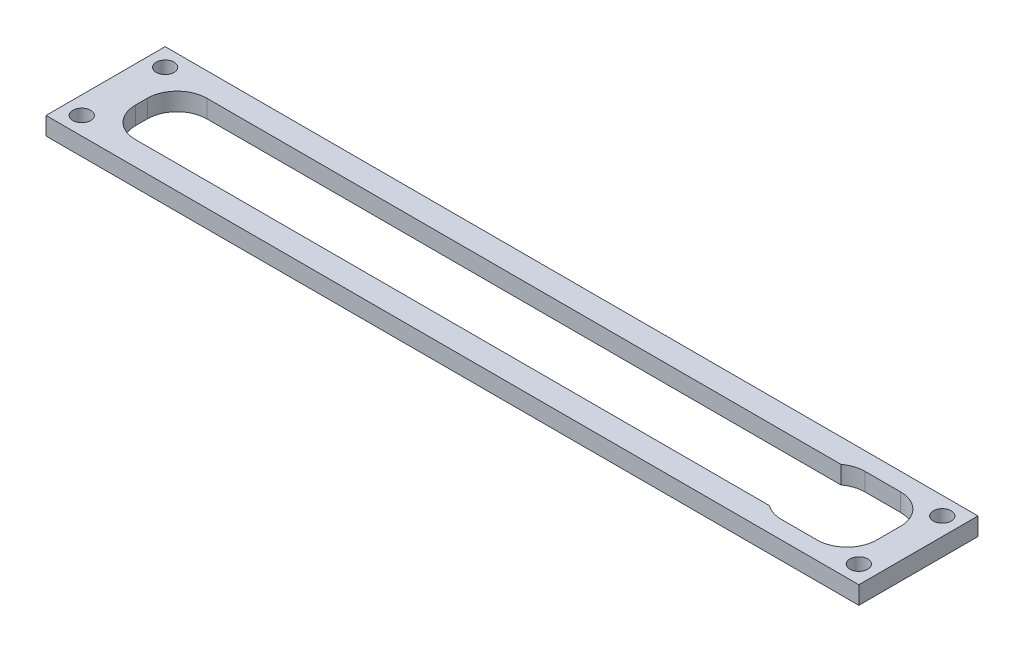
ISO-10303-21;
HEADER;
FILE_DESCRIPTION(('STEP AP214'),'2;1');
FILE_NAME('part.step','',(''),(''),'','','');
FILE_SCHEMA(('AUTOMOTIVE_DESIGN { 1 0 10303 214 1 1 1 1 }'));
ENDSEC;
DATA;
#1=APPLICATION_CONTEXT('core data for automotive mechanical design processes');
#2=APPLICATION_PROTOCOL_DEFINITION('international standard','automotive_design',2000,#1);
#3=PRODUCT_CONTEXT('',#1,'mechanical');
#4=PRODUCT('Part','Part','',(#3));
#5=PRODUCT_RELATED_PRODUCT_CATEGORY('part','',(#4));
#6=PRODUCT_DEFINITION_FORMATION('','',#4);
#7=PRODUCT_DEFINITION_CONTEXT('part definition',#1,'design');
#8=PRODUCT_DEFINITION('design','',#6,#7);
#9=PRODUCT_DEFINITION_SHAPE('','',#8);
#10=(LENGTH_UNIT() NAMED_UNIT(*) SI_UNIT(.MILLI.,.METRE.));
#11=(NAMED_UNIT(*) PLANE_ANGLE_UNIT() SI_UNIT($,.RADIAN.));
#12=(NAMED_UNIT(*) SI_UNIT($,.STERADIAN.) SOLID_ANGLE_UNIT());
#13=UNCERTAINTY_MEASURE_WITH_UNIT(LENGTH_MEASURE(1.E-05),#10,'distance_accuracy_value','');
#14=(GEOMETRIC_REPRESENTATION_CONTEXT(3) GLOBAL_UNCERTAINTY_ASSIGNED_CONTEXT((#13)) GLOBAL_UNIT_ASSIGNED_CONTEXT((#10,
#11,#12)) REPRESENTATION_CONTEXT('',''));
#15=CARTESIAN_POINT('',(0.,0.,0.));
#16=DIRECTION('',(0.,0.,1.));
#17=DIRECTION('',(1.,0.,0.));
#18=AXIS2_PLACEMENT_3D('',#15,#16,#17);
#19=CARTESIAN_POINT('',(0.,3.,0.));
#20=DIRECTION('',(0.,-1.,0.));
#21=DIRECTION('',(0.,0.,-1.));
#22=AXIS2_PLACEMENT_3D('',#19,#20,#21);
#23=PLANE('',#22);
#24=DIRECTION('',(0.,0.,1.));
#25=VECTOR('',#24,1.);
#26=CARTESIAN_POINT('',(0.,3.,0.));
#27=LINE('',#26,#25);
#28=CARTESIAN_POINT('',(0.,3.,-20.));
#29=VERTEX_POINT('',#28);
#30=CARTESIAN_POINT('',(0.,3.,0.));
#31=VERTEX_POINT('',#30);
#32=EDGE_CURVE('E250',#29,#31,#27,.T.);
#33=ORIENTED_EDGE('',*,*,#32,.T.);
#34=DIRECTION('',(1.,0.,0.));
#35=VECTOR('',#34,1.);
#36=CARTESIAN_POINT('',(0.,3.,0.));
#37=LINE('',#36,#35);
#38=CARTESIAN_POINT('',(136.427821804855,3.,0.));
#39=VERTEX_POINT('',#38);
#40=EDGE_CURVE('E253',#31,#39,#37,.T.);
#41=ORIENTED_EDGE('',*,*,#40,.T.);
#42=DIRECTION('',(0.,0.,-1.));
#43=VECTOR('',#42,1.);
#44=CARTESIAN_POINT('',(136.427821804855,3.,0.));
#45=LINE('',#44,#43);
#46=CARTESIAN_POINT('',(136.427821804855,3.,-20.));
#47=VERTEX_POINT('',#46);
#48=EDGE_CURVE('E256',#39,#47,#45,.T.);
#49=ORIENTED_EDGE('',*,*,#48,.T.);
#50=DIRECTION('',(-1.,0.,0.));
#51=VECTOR('',#50,1.);
#52=CARTESIAN_POINT('',(0.,3.,-20.));
#53=LINE('',#52,#51);
#54=EDGE_CURVE('E258',#47,#29,#53,.T.);
#55=ORIENTED_EDGE('',*,*,#54,.T.);
#56=EDGE_LOOP('',(#33,#41,#49,#55));
#57=FACE_BOUND('',#56,.T.);
#58=DIRECTION('',(-1.,0.,0.));
#59=VECTOR('',#58,1.);
#60=CARTESIAN_POINT('',(5.99999999999999,3.,-16.));
#61=LINE('',#60,#59);
#62=CARTESIAN_POINT('',(117.427821804855,3.,-16.));
#63=VERTEX_POINT('',#62);
#64=CARTESIAN_POINT('',(11.,3.,-16.));
#65=VERTEX_POINT('',#64);
#66=EDGE_CURVE('E243',#63,#65,#61,.T.);
#67=ORIENTED_EDGE('',*,*,#66,.F.);
#68=CARTESIAN_POINT('',(120.427821804855,3.,-12.));
#69=DIRECTION('',(0.,-1.,0.));
#70=DIRECTION('',(0.,0.,-1.));
#71=AXIS2_PLACEMENT_3D('',#68,#69,#70);
#72=CIRCLE('',#71,5.);
#73=CARTESIAN_POINT('',(120.427821804855,3.,-17.));
#74=VERTEX_POINT('',#73);
#75=EDGE_CURVE('E193',#63,#74,#72,.T.);
#76=ORIENTED_EDGE('',*,*,#75,.T.);
#77=DIRECTION('',(-1.,0.,0.));
#78=VECTOR('',#77,1.);
#79=CARTESIAN_POINT('',(117.427821804855,3.,-17.));
#80=LINE('',#79,#78);
#81=CARTESIAN_POINT('',(126.427821804855,3.,-17.));
#82=VERTEX_POINT('',#81);
#83=EDGE_CURVE('E205',#82,#74,#80,.T.);
#84=ORIENTED_EDGE('',*,*,#83,.F.);
#85=CARTESIAN_POINT('',(126.427821804855,3.,-12.));
#86=DIRECTION('',(0.,-1.,0.));
#87=DIRECTION('',(0.,0.,-1.));
#88=AXIS2_PLACEMENT_3D('',#85,#86,#87);
#89=CIRCLE('',#88,5.);
#90=CARTESIAN_POINT('',(131.427821804855,3.,-12.));
#91=VERTEX_POINT('',#90);
#92=EDGE_CURVE('E185',#82,#91,#89,.T.);
#93=ORIENTED_EDGE('',*,*,#92,.T.);
#94=DIRECTION('',(0.,0.,-1.));
#95=VECTOR('',#94,1.);
#96=CARTESIAN_POINT('',(131.427821804855,3.,-17.));
#97=LINE('',#96,#95);
#98=CARTESIAN_POINT('',(131.427821804855,3.,-8.00000000000001));
#99=VERTEX_POINT('',#98);
#100=EDGE_CURVE('E202',#99,#91,#97,.T.);
#101=ORIENTED_EDGE('',*,*,#100,.F.);
#102=CARTESIAN_POINT('',(126.427821804855,3.,-8.00000000000001));
#103=DIRECTION('',(0.,-1.,0.));
#104=DIRECTION('',(0.,0.,-1.));
#105=AXIS2_PLACEMENT_3D('',#102,#103,#104);
#106=CIRCLE('',#105,5.);
#107=CARTESIAN_POINT('',(126.427821804855,3.,-3.00000000000001));
#108=VERTEX_POINT('',#107);
#109=EDGE_CURVE('E189',#99,#108,#106,.T.);
#110=ORIENTED_EDGE('',*,*,#109,.T.);
#111=DIRECTION('',(1.,0.,0.));
#112=VECTOR('',#111,1.);
#113=CARTESIAN_POINT('',(117.427821804855,3.,-3.00000000000001));
#114=LINE('',#113,#112);
#115=CARTESIAN_POINT('',(120.427821804855,3.,-3.00000000000001));
#116=VERTEX_POINT('',#115);
#117=EDGE_CURVE('E200',#116,#108,#114,.T.);
#118=ORIENTED_EDGE('',*,*,#117,.F.);
#119=CARTESIAN_POINT('',(120.427821804855,3.,-8.00000000000001));
#120=DIRECTION('',(0.,-1.,0.));
#121=DIRECTION('',(0.,0.,-1.));
#122=AXIS2_PLACEMENT_3D('',#119,#120,#121);
#123=CIRCLE('',#122,5.);
#124=CARTESIAN_POINT('',(117.427821804855,3.,-4.00000000000002));
#125=VERTEX_POINT('',#124);
#126=EDGE_CURVE('E43',#116,#125,#123,.T.);
#127=ORIENTED_EDGE('',*,*,#126,.T.);
#128=DIRECTION('',(1.,0.,0.));
#129=VECTOR('',#128,1.);
#130=CARTESIAN_POINT('',(5.99999999999999,3.,-4.00000000000002));
#131=LINE('',#130,#129);
#132=CARTESIAN_POINT('',(11.,3.,-4.00000000000002));
#133=VERTEX_POINT('',#132);
#134=EDGE_CURVE('E162',#133,#125,#131,.T.);
#135=ORIENTED_EDGE('',*,*,#134,.F.);
#136=CARTESIAN_POINT('',(11.,3.,-9.00000000000001));
#137=DIRECTION('',(0.,-1.,0.));
#138=DIRECTION('',(0.,0.,-1.));
#139=AXIS2_PLACEMENT_3D('',#136,#137,#138);
#140=CIRCLE('',#139,5.);
#141=CARTESIAN_POINT('',(5.99999999999999,3.,-9.00000000000001));
#142=VERTEX_POINT('',#141);
#143=EDGE_CURVE('E179',#133,#142,#140,.T.);
#144=ORIENTED_EDGE('',*,*,#143,.T.);
#145=DIRECTION('',(0.,0.,1.));
#146=VECTOR('',#145,1.);
#147=CARTESIAN_POINT('',(5.99999999999999,3.,-16.));
#148=LINE('',#147,#146);
#149=CARTESIAN_POINT('',(5.99999999999999,3.,-11.));
#150=VERTEX_POINT('',#149);
#151=EDGE_CURVE('E239',#150,#142,#148,.T.);
#152=ORIENTED_EDGE('',*,*,#151,.F.);
#153=CARTESIAN_POINT('',(11.,3.,-11.));
#154=DIRECTION('',(0.,-1.,0.));
#155=DIRECTION('',(0.,0.,-1.));
#156=AXIS2_PLACEMENT_3D('',#153,#154,#155);
#157=CIRCLE('',#156,5.);
#158=EDGE_CURVE('E183',#150,#65,#157,.T.);
#159=ORIENTED_EDGE('',*,*,#158,.T.);
#160=EDGE_LOOP('',(#67,#76,#84,#93,#101,#110,#118,#127,#135,#144,#152,#159));
#161=FACE_BOUND('',#160,.T.);
#162=CARTESIAN_POINT('',(3.,3.,-17.));
#163=DIRECTION('',(0.,1.,0.));
#164=DIRECTION('',(0.,0.,1.));
#165=AXIS2_PLACEMENT_3D('',#162,#163,#164);
#166=CIRCLE('',#165,1.5);
#167=CARTESIAN_POINT('',(3.,3.,-15.5));
#168=VERTEX_POINT('',#167);
#169=EDGE_CURVE('E234',#168,#168,#166,.T.);
#170=ORIENTED_EDGE('',*,*,#169,.F.);
#171=EDGE_LOOP('',(#170));
#172=FACE_BOUND('',#171,.T.);
#173=CARTESIAN_POINT('',(3.,3.,-3.));
#174=DIRECTION('',(0.,1.,0.));
#175=DIRECTION('',(0.,0.,-1.));
#176=AXIS2_PLACEMENT_3D('',#173,#174,#175);
#177=CIRCLE('',#176,1.5);
#178=CARTESIAN_POINT('',(3.,3.,-4.5));
#179=VERTEX_POINT('',#178);
#180=EDGE_CURVE('E228',#179,#179,#177,.T.);
#181=ORIENTED_EDGE('',*,*,#180,.F.);
#182=EDGE_LOOP('',(#181));
#183=FACE_BOUND('',#182,.T.);
#184=CARTESIAN_POINT('',(133.427821804855,3.,-3.00000000000002));
#185=DIRECTION('',(0.,1.,0.));
#186=DIRECTION('',(0.,0.,1.));
#187=AXIS2_PLACEMENT_3D('',#184,#185,#186);
#188=CIRCLE('',#187,1.5);
#189=CARTESIAN_POINT('',(133.427821804855,3.,-1.50000000000002));
#190=VERTEX_POINT('',#189);
#191=EDGE_CURVE('E222',#190,#190,#188,.T.);
#192=ORIENTED_EDGE('',*,*,#191,.F.);
#193=EDGE_LOOP('',(#192));
#194=FACE_BOUND('',#193,.T.);
#195=CARTESIAN_POINT('',(133.427821804855,3.,-17.0000000000001));
#196=DIRECTION('',(0.,1.,0.));
#197=DIRECTION('',(0.,0.,-1.));
#198=AXIS2_PLACEMENT_3D('',#195,#196,#197);
#199=CIRCLE('',#198,1.5);
#200=CARTESIAN_POINT('',(133.427821804855,3.,-18.5));
#201=VERTEX_POINT('',#200);
#202=EDGE_CURVE('E216',#201,#201,#199,.T.);
#203=ORIENTED_EDGE('',*,*,#202,.F.);
#204=EDGE_LOOP('',(#203));
#205=FACE_BOUND('',#204,.T.);
#206=ADVANCED_FACE('F35',(#57,#161,#172,#183,#194,#205),#23,.F.);
#207=CARTESIAN_POINT('',(0.,0.,0.));
#208=DIRECTION('',(0.,-1.,0.));
#209=DIRECTION('',(0.,0.,-1.));
#210=AXIS2_PLACEMENT_3D('',#207,#208,#209);
#211=PLANE('',#210);
#212=DIRECTION('',(-1.,0.,0.));
#213=VECTOR('',#212,1.);
#214=CARTESIAN_POINT('',(117.427821804855,0.,-17.));
#215=LINE('',#214,#213);
#216=CARTESIAN_POINT('',(126.427821804855,0.,-17.));
#217=VERTEX_POINT('',#216);
#218=CARTESIAN_POINT('',(120.427821804855,0.,-17.));
#219=VERTEX_POINT('',#218);
#220=EDGE_CURVE('E165',#217,#219,#215,.T.);
#221=ORIENTED_EDGE('',*,*,#220,.T.);
#222=CARTESIAN_POINT('',(120.427821804855,0.,-12.));
#223=DIRECTION('',(0.,-1.,0.));
#224=DIRECTION('',(0.,0.,-1.));
#225=AXIS2_PLACEMENT_3D('',#222,#223,#224);
#226=CIRCLE('',#225,5.);
#227=CARTESIAN_POINT('',(117.427821804855,0.,-16.));
#228=VERTEX_POINT('',#227);
#229=EDGE_CURVE('E195',#219,#228,#226,.F.);
#230=ORIENTED_EDGE('',*,*,#229,.T.);
#231=DIRECTION('',(-1.,0.,0.));
#232=VECTOR('',#231,1.);
#233=CARTESIAN_POINT('',(5.99999999999999,0.,-16.));
#234=LINE('',#233,#232);
#235=CARTESIAN_POINT('',(11.,0.,-16.));
#236=VERTEX_POINT('',#235);
#237=EDGE_CURVE('E154',#228,#236,#234,.T.);
#238=ORIENTED_EDGE('',*,*,#237,.T.);
#239=CARTESIAN_POINT('',(11.,0.,-11.));
#240=DIRECTION('',(0.,-1.,0.));
#241=DIRECTION('',(0.,0.,-1.));
#242=AXIS2_PLACEMENT_3D('',#239,#240,#241);
#243=CIRCLE('',#242,5.);
#244=CARTESIAN_POINT('',(5.99999999999999,0.,-11.));
#245=VERTEX_POINT('',#244);
#246=EDGE_CURVE('E181',#236,#245,#243,.F.);
#247=ORIENTED_EDGE('',*,*,#246,.T.);
#248=DIRECTION('',(0.,0.,1.));
#249=VECTOR('',#248,1.);
#250=CARTESIAN_POINT('',(5.99999999999999,0.,-16.));
#251=LINE('',#250,#249);
#252=CARTESIAN_POINT('',(5.99999999999999,0.,-9.00000000000001));
#253=VERTEX_POINT('',#252);
#254=EDGE_CURVE('E155',#245,#253,#251,.T.);
#255=ORIENTED_EDGE('',*,*,#254,.T.);
#256=CARTESIAN_POINT('',(11.,0.,-9.00000000000001));
#257=DIRECTION('',(0.,-1.,0.));
#258=DIRECTION('',(0.,0.,-1.));
#259=AXIS2_PLACEMENT_3D('',#256,#257,#258);
#260=CIRCLE('',#259,5.);
#261=CARTESIAN_POINT('',(11.,0.,-4.00000000000002));
#262=VERTEX_POINT('',#261);
#263=EDGE_CURVE('E151',#253,#262,#260,.F.);
#264=ORIENTED_EDGE('',*,*,#263,.T.);
#265=DIRECTION('',(1.,0.,0.));
#266=VECTOR('',#265,1.);
#267=CARTESIAN_POINT('',(5.99999999999999,0.,-4.00000000000002));
#268=LINE('',#267,#266);
#269=CARTESIAN_POINT('',(117.427821804855,0.,-4.00000000000002));
#270=VERTEX_POINT('',#269);
#271=EDGE_CURVE('E145',#262,#270,#268,.T.);
#272=ORIENTED_EDGE('',*,*,#271,.T.);
#273=CARTESIAN_POINT('',(120.427821804855,0.,-8.00000000000001));
#274=DIRECTION('',(0.,-1.,0.));
#275=DIRECTION('',(0.,0.,-1.));
#276=AXIS2_PLACEMENT_3D('',#273,#274,#275);
#277=CIRCLE('',#276,5.);
#278=CARTESIAN_POINT('',(120.427821804855,0.,-3.00000000000001));
#279=VERTEX_POINT('',#278);
#280=EDGE_CURVE('E11',#270,#279,#277,.F.);
#281=ORIENTED_EDGE('',*,*,#280,.T.);
#282=DIRECTION('',(1.,0.,0.));
#283=VECTOR('',#282,1.);
#284=CARTESIAN_POINT('',(117.427821804855,0.,-3.00000000000001));
#285=LINE('',#284,#283);
#286=CARTESIAN_POINT('',(126.427821804855,0.,-3.00000000000001));
#287=VERTEX_POINT('',#286);
#288=EDGE_CURVE('E212',#279,#287,#285,.T.);
#289=ORIENTED_EDGE('',*,*,#288,.T.);
#290=CARTESIAN_POINT('',(126.427821804855,0.,-8.00000000000001));
#291=DIRECTION('',(0.,-1.,0.));
#292=DIRECTION('',(0.,0.,-1.));
#293=AXIS2_PLACEMENT_3D('',#290,#291,#292);
#294=CIRCLE('',#293,5.);
#295=CARTESIAN_POINT('',(131.427821804855,0.,-8.00000000000001));
#296=VERTEX_POINT('',#295);
#297=EDGE_CURVE('E191',#287,#296,#294,.F.);
#298=ORIENTED_EDGE('',*,*,#297,.T.);
#299=DIRECTION('',(0.,0.,-1.));
#300=VECTOR('',#299,1.);
#301=CARTESIAN_POINT('',(131.427821804855,0.,-17.));
#302=LINE('',#301,#300);
#303=CARTESIAN_POINT('',(131.427821804855,0.,-12.));
#304=VERTEX_POINT('',#303);
#305=EDGE_CURVE('E300',#296,#304,#302,.T.);
#306=ORIENTED_EDGE('',*,*,#305,.T.);
#307=CARTESIAN_POINT('',(126.427821804855,0.,-12.));
#308=DIRECTION('',(0.,-1.,0.));
#309=DIRECTION('',(0.,0.,-1.));
#310=AXIS2_PLACEMENT_3D('',#307,#308,#309);
#311=CIRCLE('',#310,5.);
#312=EDGE_CURVE('E187',#304,#217,#311,.F.);
#313=ORIENTED_EDGE('',*,*,#312,.T.);
#314=EDGE_LOOP('',(#221,#230,#238,#247,#255,#264,#272,#281,#289,#298,#306,#313));
#315=FACE_BOUND('',#314,.T.);
#316=CARTESIAN_POINT('',(133.427821804855,0.,-3.00000000000002));
#317=DIRECTION('',(0.,1.,0.));
#318=DIRECTION('',(0.,0.,1.));
#319=AXIS2_PLACEMENT_3D('',#316,#317,#318);
#320=CIRCLE('',#319,1.5);
#321=CARTESIAN_POINT('',(133.427821804855,0.,-1.50000000000002));
#322=VERTEX_POINT('',#321);
#323=EDGE_CURVE('E219',#322,#322,#320,.T.);
#324=ORIENTED_EDGE('',*,*,#323,.T.);
#325=EDGE_LOOP('',(#324));
#326=FACE_BOUND('',#325,.T.);
#327=CARTESIAN_POINT('',(3.,0.,-17.));
#328=DIRECTION('',(0.,1.,0.));
#329=DIRECTION('',(0.,0.,1.));
#330=AXIS2_PLACEMENT_3D('',#327,#328,#329);
#331=CIRCLE('',#330,1.5);
#332=CARTESIAN_POINT('',(3.,0.,-15.5));
#333=VERTEX_POINT('',#332);
#334=EDGE_CURVE('E231',#333,#333,#331,.T.);
#335=ORIENTED_EDGE('',*,*,#334,.T.);
#336=EDGE_LOOP('',(#335));
#337=FACE_BOUND('',#336,.T.);
#338=DIRECTION('',(0.,0.,1.));
#339=VECTOR('',#338,1.);
#340=CARTESIAN_POINT('',(0.,0.,0.));
#341=LINE('',#340,#339);
#342=CARTESIAN_POINT('',(0.,0.,-20.));
#343=VERTEX_POINT('',#342);
#344=CARTESIAN_POINT('',(0.,0.,0.));
#345=VERTEX_POINT('',#344);
#346=EDGE_CURVE('E246',#343,#345,#341,.T.);
#347=ORIENTED_EDGE('',*,*,#346,.F.);
#348=DIRECTION('',(-1.,0.,0.));
#349=VECTOR('',#348,1.);
#350=CARTESIAN_POINT('',(0.,0.,-20.));
#351=LINE('',#350,#349);
#352=CARTESIAN_POINT('',(136.427821804855,0.,-20.));
#353=VERTEX_POINT('',#352);
#354=EDGE_CURVE('E254',#353,#343,#351,.T.);
#355=ORIENTED_EDGE('',*,*,#354,.F.);
#356=DIRECTION('',(0.,0.,-1.));
#357=VECTOR('',#356,1.);
#358=CARTESIAN_POINT('',(136.427821804855,0.,0.));
#359=LINE('',#358,#357);
#360=CARTESIAN_POINT('',(136.427821804855,0.,0.));
#361=VERTEX_POINT('',#360);
#362=EDGE_CURVE('E265',#361,#353,#359,.T.);
#363=ORIENTED_EDGE('',*,*,#362,.F.);
#364=DIRECTION('',(1.,0.,0.));
#365=VECTOR('',#364,1.);
#366=CARTESIAN_POINT('',(0.,0.,0.));
#367=LINE('',#366,#365);
#368=EDGE_CURVE('E263',#345,#361,#367,.T.);
#369=ORIENTED_EDGE('',*,*,#368,.F.);
#370=EDGE_LOOP('',(#347,#355,#363,#369));
#371=FACE_BOUND('',#370,.T.);
#372=CARTESIAN_POINT('',(3.,0.,-3.));
#373=DIRECTION('',(0.,1.,0.));
#374=DIRECTION('',(0.,0.,-1.));
#375=AXIS2_PLACEMENT_3D('',#372,#373,#374);
#376=CIRCLE('',#375,1.5);
#377=CARTESIAN_POINT('',(3.,0.,-4.5));
#378=VERTEX_POINT('',#377);
#379=EDGE_CURVE('E225',#378,#378,#376,.T.);
#380=ORIENTED_EDGE('',*,*,#379,.T.);
#381=EDGE_LOOP('',(#380));
#382=FACE_BOUND('',#381,.T.);
#383=CARTESIAN_POINT('',(133.427821804855,0.,-17.0000000000001));
#384=DIRECTION('',(0.,1.,0.));
#385=DIRECTION('',(0.,0.,-1.));
#386=AXIS2_PLACEMENT_3D('',#383,#384,#385);
#387=CIRCLE('',#386,1.5);
#388=CARTESIAN_POINT('',(133.427821804855,0.,-18.5));
#389=VERTEX_POINT('',#388);
#390=EDGE_CURVE('E214',#389,#389,#387,.T.);
#391=ORIENTED_EDGE('',*,*,#390,.T.);
#392=EDGE_LOOP('',(#391));
#393=FACE_BOUND('',#392,.T.);
#394=ADVANCED_FACE('F148',(#315,#326,#337,#371,#382,#393),#211,.T.);
#395=CARTESIAN_POINT('',(0.,3.,0.));
#396=DIRECTION('',(1.,0.,0.));
#397=DIRECTION('',(0.,0.,-1.));
#398=AXIS2_PLACEMENT_3D('',#395,#396,#397);
#399=PLANE('',#398);
#400=ORIENTED_EDGE('',*,*,#346,.T.);
#401=DIRECTION('',(0.,-1.,0.));
#402=VECTOR('',#401,1.);
#403=CARTESIAN_POINT('',(0.,3.,0.));
#404=LINE('',#403,#402);
#405=EDGE_CURVE('E276',#31,#345,#404,.T.);
#406=ORIENTED_EDGE('',*,*,#405,.F.);
#407=ORIENTED_EDGE('',*,*,#32,.F.);
#408=DIRECTION('',(0.,-1.,0.));
#409=VECTOR('',#408,1.);
#410=CARTESIAN_POINT('',(0.,3.,-20.));
#411=LINE('',#410,#409);
#412=EDGE_CURVE('E260',#29,#343,#411,.T.);
#413=ORIENTED_EDGE('',*,*,#412,.T.);
#414=EDGE_LOOP('',(#400,#406,#407,#413));
#415=FACE_BOUND('',#414,.T.);
#416=ADVANCED_FACE('F331',(#415),#399,.F.);
#417=CARTESIAN_POINT('',(0.,3.,0.));
#418=DIRECTION('',(0.,0.,-1.));
#419=DIRECTION('',(-1.,0.,0.));
#420=AXIS2_PLACEMENT_3D('',#417,#418,#419);
#421=PLANE('',#420);
#422=ORIENTED_EDGE('',*,*,#368,.T.);
#423=DIRECTION('',(0.,-1.,0.));
#424=VECTOR('',#423,1.);
#425=CARTESIAN_POINT('',(136.427821804855,3.,0.));
#426=LINE('',#425,#424);
#427=EDGE_CURVE('E273',#39,#361,#426,.T.);
#428=ORIENTED_EDGE('',*,*,#427,.F.);
#429=ORIENTED_EDGE('',*,*,#40,.F.);
#430=ORIENTED_EDGE('',*,*,#405,.T.);
#431=EDGE_LOOP('',(#422,#428,#429,#430));
#432=FACE_BOUND('',#431,.T.);
#433=ADVANCED_FACE('F344',(#432),#421,.F.);
#434=CARTESIAN_POINT('',(136.427821804855,3.,0.));
#435=DIRECTION('',(-1.,0.,0.));
#436=DIRECTION('',(0.,0.,1.));
#437=AXIS2_PLACEMENT_3D('',#434,#435,#436);
#438=PLANE('',#437);
#439=ORIENTED_EDGE('',*,*,#362,.T.);
#440=DIRECTION('',(0.,-1.,0.));
#441=VECTOR('',#440,1.);
#442=CARTESIAN_POINT('',(136.427821804855,3.,-20.));
#443=LINE('',#442,#441);
#444=EDGE_CURVE('E270',#47,#353,#443,.T.);
#445=ORIENTED_EDGE('',*,*,#444,.F.);
#446=ORIENTED_EDGE('',*,*,#48,.F.);
#447=ORIENTED_EDGE('',*,*,#427,.T.);
#448=EDGE_LOOP('',(#439,#445,#446,#447));
#449=FACE_BOUND('',#448,.T.);
#450=ADVANCED_FACE('F340',(#449),#438,.F.);
#451=CARTESIAN_POINT('',(0.,3.,-20.));
#452=DIRECTION('',(0.,0.,1.));
#453=DIRECTION('',(1.,0.,0.));
#454=AXIS2_PLACEMENT_3D('',#451,#452,#453);
#455=PLANE('',#454);
#456=ORIENTED_EDGE('',*,*,#354,.T.);
#457=ORIENTED_EDGE('',*,*,#412,.F.);
#458=ORIENTED_EDGE('',*,*,#54,.F.);
#459=ORIENTED_EDGE('',*,*,#444,.T.);
#460=EDGE_LOOP('',(#456,#457,#458,#459));
#461=FACE_BOUND('',#460,.T.);
#462=ADVANCED_FACE('F337',(#461),#455,.F.);
#463=CARTESIAN_POINT('',(5.99999999999999,3.,-16.));
#464=DIRECTION('',(1.,0.,0.));
#465=DIRECTION('',(0.,0.,-1.));
#466=AXIS2_PLACEMENT_3D('',#463,#464,#465);
#467=PLANE('',#466);
#468=ORIENTED_EDGE('',*,*,#151,.T.);
#469=DIRECTION('',(0.,-1.,0.));
#470=VECTOR('',#469,1.);
#471=CARTESIAN_POINT('',(5.99999999999999,0.,-9.00000000000001));
#472=LINE('',#471,#470);
#473=EDGE_CURVE('E281',#142,#253,#472,.T.);
#474=ORIENTED_EDGE('',*,*,#473,.T.);
#475=ORIENTED_EDGE('',*,*,#254,.F.);
#476=DIRECTION('',(0.,-1.,0.));
#477=VECTOR('',#476,1.);
#478=CARTESIAN_POINT('',(5.99999999999999,3.,-11.));
#479=LINE('',#478,#477);
#480=EDGE_CURVE('E279',#245,#150,#479,.F.);
#481=ORIENTED_EDGE('',*,*,#480,.T.);
#482=EDGE_LOOP('',(#468,#474,#475,#481));
#483=FACE_BOUND('',#482,.T.);
#484=ADVANCED_FACE('F334',(#483),#467,.T.);
#485=CARTESIAN_POINT('',(5.99999999999999,3.,-4.00000000000002));
#486=DIRECTION('',(0.,0.,-1.));
#487=DIRECTION('',(-1.,0.,0.));
#488=AXIS2_PLACEMENT_3D('',#485,#486,#487);
#489=PLANE('',#488);
#490=ORIENTED_EDGE('',*,*,#271,.F.);
#491=DIRECTION('',(0.,-1.,0.));
#492=VECTOR('',#491,1.);
#493=CARTESIAN_POINT('',(11.,3.,-4.00000000000002));
#494=LINE('',#493,#492);
#495=EDGE_CURVE('E284',#262,#133,#494,.F.);
#496=ORIENTED_EDGE('',*,*,#495,.T.);
#497=ORIENTED_EDGE('',*,*,#134,.T.);
#498=DIRECTION('',(0.,1.,0.));
#499=VECTOR('',#498,1.);
#500=CARTESIAN_POINT('',(117.427821804855,0.,-4.00000000000002));
#501=LINE('',#500,#499);
#502=EDGE_CURVE('E159',#270,#125,#501,.T.);
#503=ORIENTED_EDGE('',*,*,#502,.F.);
#504=EDGE_LOOP('',(#490,#496,#497,#503));
#505=FACE_BOUND('',#504,.T.);
#506=ADVANCED_FACE('F160',(#505),#489,.T.);
#507=CARTESIAN_POINT('',(5.99999999999999,3.,-16.));
#508=DIRECTION('',(0.,0.,1.));
#509=DIRECTION('',(1.,0.,0.));
#510=AXIS2_PLACEMENT_3D('',#507,#508,#509);
#511=PLANE('',#510);
#512=ORIENTED_EDGE('',*,*,#66,.T.);
#513=DIRECTION('',(0.,-1.,0.));
#514=VECTOR('',#513,1.);
#515=CARTESIAN_POINT('',(11.,0.,-16.));
#516=LINE('',#515,#514);
#517=EDGE_CURVE('E286',#65,#236,#516,.T.);
#518=ORIENTED_EDGE('',*,*,#517,.T.);
#519=ORIENTED_EDGE('',*,*,#237,.F.);
#520=DIRECTION('',(0.,1.,0.));
#521=VECTOR('',#520,1.);
#522=CARTESIAN_POINT('',(117.427821804855,0.,-16.));
#523=LINE('',#522,#521);
#524=EDGE_CURVE('E164',#228,#63,#523,.T.);
#525=ORIENTED_EDGE('',*,*,#524,.T.);
#526=EDGE_LOOP('',(#512,#518,#519,#525));
#527=FACE_BOUND('',#526,.T.);
#528=ADVANCED_FACE('F366',(#527),#511,.T.);
#529=CARTESIAN_POINT('',(3.,3.,-17.));
#530=DIRECTION('',(0.,-1.,0.));
#531=DIRECTION('',(0.,0.,-1.));
#532=AXIS2_PLACEMENT_3D('',#529,#530,#531);
#533=CYLINDRICAL_SURFACE('',#532,1.5);
#534=ORIENTED_EDGE('',*,*,#169,.T.);
#535=EDGE_LOOP('',(#534));
#536=FACE_BOUND('',#535,.T.);
#537=ORIENTED_EDGE('',*,*,#334,.F.);
#538=EDGE_LOOP('',(#537));
#539=FACE_BOUND('',#538,.T.);
#540=ADVANCED_FACE('F379',(#536,#539),#533,.F.);
#541=CARTESIAN_POINT('',(3.,3.,-3.));
#542=DIRECTION('',(0.,-1.,0.));
#543=DIRECTION('',(0.,0.,-1.));
#544=AXIS2_PLACEMENT_3D('',#541,#542,#543);
#545=CYLINDRICAL_SURFACE('',#544,1.5);
#546=ORIENTED_EDGE('',*,*,#180,.T.);
#547=EDGE_LOOP('',(#546));
#548=FACE_BOUND('',#547,.T.);
#549=ORIENTED_EDGE('',*,*,#379,.F.);
#550=EDGE_LOOP('',(#549));
#551=FACE_BOUND('',#550,.T.);
#552=ADVANCED_FACE('F384',(#548,#551),#545,.F.);
#553=CARTESIAN_POINT('',(133.427821804855,3.,-3.00000000000002));
#554=DIRECTION('',(0.,-1.,0.));
#555=DIRECTION('',(0.,0.,-1.));
#556=AXIS2_PLACEMENT_3D('',#553,#554,#555);
#557=CYLINDRICAL_SURFACE('',#556,1.5);
#558=ORIENTED_EDGE('',*,*,#191,.T.);
#559=EDGE_LOOP('',(#558));
#560=FACE_BOUND('',#559,.T.);
#561=ORIENTED_EDGE('',*,*,#323,.F.);
#562=EDGE_LOOP('',(#561));
#563=FACE_BOUND('',#562,.T.);
#564=ADVANCED_FACE('F388',(#560,#563),#557,.F.);
#565=CARTESIAN_POINT('',(133.427821804855,3.,-17.0000000000001));
#566=DIRECTION('',(0.,-1.,0.));
#567=DIRECTION('',(0.,0.,-1.));
#568=AXIS2_PLACEMENT_3D('',#565,#566,#567);
#569=CYLINDRICAL_SURFACE('',#568,1.5);
#570=ORIENTED_EDGE('',*,*,#202,.T.);
#571=EDGE_LOOP('',(#570));
#572=FACE_BOUND('',#571,.T.);
#573=ORIENTED_EDGE('',*,*,#390,.F.);
#574=EDGE_LOOP('',(#573));
#575=FACE_BOUND('',#574,.T.);
#576=ADVANCED_FACE('F392',(#572,#575),#569,.F.);
#577=CARTESIAN_POINT('',(117.427821804855,0.,-17.));
#578=DIRECTION('',(0.,0.,-1.));
#579=DIRECTION('',(-1.,0.,0.));
#580=AXIS2_PLACEMENT_3D('',#577,#578,#579);
#581=PLANE('',#580);
#582=ORIENTED_EDGE('',*,*,#220,.F.);
#583=DIRECTION('',(0.,1.,0.));
#584=VECTOR('',#583,1.);
#585=CARTESIAN_POINT('',(126.427821804855,3.,-17.));
#586=LINE('',#585,#584);
#587=EDGE_CURVE('E291',#217,#82,#586,.T.);
#588=ORIENTED_EDGE('',*,*,#587,.T.);
#589=ORIENTED_EDGE('',*,*,#83,.T.);
#590=DIRECTION('',(0.,1.,0.));
#591=VECTOR('',#590,1.);
#592=CARTESIAN_POINT('',(120.427821804855,0.,-17.));
#593=LINE('',#592,#591);
#594=EDGE_CURVE('E289',#74,#219,#593,.F.);
#595=ORIENTED_EDGE('',*,*,#594,.T.);
#596=EDGE_LOOP('',(#582,#588,#589,#595));
#597=FACE_BOUND('',#596,.T.);
#598=ADVANCED_FACE('F310',(#597),#581,.F.);
#599=CARTESIAN_POINT('',(131.427821804855,0.,-17.));
#600=DIRECTION('',(1.,0.,0.));
#601=DIRECTION('',(0.,0.,-1.));
#602=AXIS2_PLACEMENT_3D('',#599,#600,#601);
#603=PLANE('',#602);
#604=ORIENTED_EDGE('',*,*,#100,.T.);
#605=DIRECTION('',(0.,1.,0.));
#606=VECTOR('',#605,1.);
#607=CARTESIAN_POINT('',(131.427821804855,0.,-12.));
#608=LINE('',#607,#606);
#609=EDGE_CURVE('E171',#91,#304,#608,.F.);
#610=ORIENTED_EDGE('',*,*,#609,.T.);
#611=ORIENTED_EDGE('',*,*,#305,.F.);
#612=DIRECTION('',(0.,1.,0.));
#613=VECTOR('',#612,1.);
#614=CARTESIAN_POINT('',(131.427821804855,3.,-8.00000000000001));
#615=LINE('',#614,#613);
#616=EDGE_CURVE('E174',#296,#99,#615,.T.);
#617=ORIENTED_EDGE('',*,*,#616,.T.);
#618=EDGE_LOOP('',(#604,#610,#611,#617));
#619=FACE_BOUND('',#618,.T.);
#620=ADVANCED_FACE('F297',(#619),#603,.F.);
#621=CARTESIAN_POINT('',(117.427821804855,0.,-3.00000000000001));
#622=DIRECTION('',(0.,0.,1.));
#623=DIRECTION('',(1.,0.,0.));
#624=AXIS2_PLACEMENT_3D('',#621,#622,#623);
#625=PLANE('',#624);
#626=ORIENTED_EDGE('',*,*,#117,.T.);
#627=DIRECTION('',(0.,1.,0.));
#628=VECTOR('',#627,1.);
#629=CARTESIAN_POINT('',(126.427821804855,0.,-3.00000000000001));
#630=LINE('',#629,#628);
#631=EDGE_CURVE('E50',#108,#287,#630,.F.);
#632=ORIENTED_EDGE('',*,*,#631,.T.);
#633=ORIENTED_EDGE('',*,*,#288,.F.);
#634=DIRECTION('',(0.,-1.,0.));
#635=VECTOR('',#634,1.);
#636=CARTESIAN_POINT('',(120.427821804855,0.,-3.00000000000001));
#637=LINE('',#636,#635);
#638=EDGE_CURVE('E169',#279,#116,#637,.F.);
#639=ORIENTED_EDGE('',*,*,#638,.T.);
#640=EDGE_LOOP('',(#626,#632,#633,#639));
#641=FACE_BOUND('',#640,.T.);
#642=ADVANCED_FACE('F355',(#641),#625,.F.);
#643=CARTESIAN_POINT('',(11.,3.,-9.00000000000001));
#644=DIRECTION('',(0.,1.,0.));
#645=DIRECTION('',(0.,0.,1.));
#646=AXIS2_PLACEMENT_3D('',#643,#644,#645);
#647=CYLINDRICAL_SURFACE('',#646,5.);
#648=ORIENTED_EDGE('',*,*,#143,.F.);
#649=ORIENTED_EDGE('',*,*,#495,.F.);
#650=ORIENTED_EDGE('',*,*,#263,.F.);
#651=ORIENTED_EDGE('',*,*,#473,.F.);
#652=EDGE_LOOP('',(#648,#649,#650,#651));
#653=FACE_BOUND('',#652,.T.);
#654=ADVANCED_FACE('F352',(#653),#647,.F.);
#655=CARTESIAN_POINT('',(11.,3.,-11.));
#656=DIRECTION('',(0.,1.,0.));
#657=DIRECTION('',(0.,0.,1.));
#658=AXIS2_PLACEMENT_3D('',#655,#656,#657);
#659=CYLINDRICAL_SURFACE('',#658,5.);
#660=ORIENTED_EDGE('',*,*,#158,.F.);
#661=ORIENTED_EDGE('',*,*,#480,.F.);
#662=ORIENTED_EDGE('',*,*,#246,.F.);
#663=ORIENTED_EDGE('',*,*,#517,.F.);
#664=EDGE_LOOP('',(#660,#661,#662,#663));
#665=FACE_BOUND('',#664,.T.);
#666=ADVANCED_FACE('F323',(#665),#659,.F.);
#667=CARTESIAN_POINT('',(126.427821804855,0.,-12.));
#668=DIRECTION('',(0.,-1.,0.));
#669=DIRECTION('',(0.,0.,-1.));
#670=AXIS2_PLACEMENT_3D('',#667,#668,#669);
#671=CYLINDRICAL_SURFACE('',#670,5.);
#672=ORIENTED_EDGE('',*,*,#312,.F.);
#673=ORIENTED_EDGE('',*,*,#609,.F.);
#674=ORIENTED_EDGE('',*,*,#92,.F.);
#675=ORIENTED_EDGE('',*,*,#587,.F.);
#676=EDGE_LOOP('',(#672,#673,#674,#675));
#677=FACE_BOUND('',#676,.T.);
#678=ADVANCED_FACE('F307',(#677),#671,.F.);
#679=CARTESIAN_POINT('',(126.427821804855,0.,-8.00000000000001));
#680=DIRECTION('',(0.,-1.,0.));
#681=DIRECTION('',(0.,0.,-1.));
#682=AXIS2_PLACEMENT_3D('',#679,#680,#681);
#683=CYLINDRICAL_SURFACE('',#682,5.);
#684=ORIENTED_EDGE('',*,*,#297,.F.);
#685=ORIENTED_EDGE('',*,*,#631,.F.);
#686=ORIENTED_EDGE('',*,*,#109,.F.);
#687=ORIENTED_EDGE('',*,*,#616,.F.);
#688=EDGE_LOOP('',(#684,#685,#686,#687));
#689=FACE_BOUND('',#688,.T.);
#690=ADVANCED_FACE('F314',(#689),#683,.F.);
#691=CARTESIAN_POINT('',(120.427821804855,0.,-12.));
#692=DIRECTION('',(0.,1.,0.));
#693=DIRECTION('',(0.,0.,1.));
#694=AXIS2_PLACEMENT_3D('',#691,#692,#693);
#695=CYLINDRICAL_SURFACE('',#694,5.);
#696=ORIENTED_EDGE('',*,*,#229,.F.);
#697=ORIENTED_EDGE('',*,*,#594,.F.);
#698=ORIENTED_EDGE('',*,*,#75,.F.);
#699=ORIENTED_EDGE('',*,*,#524,.F.);
#700=EDGE_LOOP('',(#696,#697,#698,#699));
#701=FACE_BOUND('',#700,.T.);
#702=ADVANCED_FACE('F316',(#701),#695,.F.);
#703=CARTESIAN_POINT('',(120.427821804855,0.,-8.00000000000001));
#704=DIRECTION('',(0.,-1.,0.));
#705=DIRECTION('',(0.,0.,-1.));
#706=AXIS2_PLACEMENT_3D('',#703,#704,#705);
#707=CYLINDRICAL_SURFACE('',#706,5.);
#708=ORIENTED_EDGE('',*,*,#280,.F.);
#709=ORIENTED_EDGE('',*,*,#502,.T.);
#710=ORIENTED_EDGE('',*,*,#126,.F.);
#711=ORIENTED_EDGE('',*,*,#638,.F.);
#712=EDGE_LOOP('',(#708,#709,#710,#711));
#713=FACE_BOUND('',#712,.T.);
#714=ADVANCED_FACE('F37',(#713),#707,.F.);
#715=CLOSED_SHELL('',(#206,#394,#416,#433,#450,#462,#484,#506,#528,#540,#552,#564,#576,#598,
#620,#642,#654,#666,#678,#690,#702,#714));
#716=MANIFOLD_SOLID_BREP('B2',#715);
#717=ADVANCED_BREP_SHAPE_REPRESENTATION('',(#18,#716),#14);
#718=SHAPE_DEFINITION_REPRESENTATION(#9,#717);
ENDSEC;
END-ISO-10303-21;
